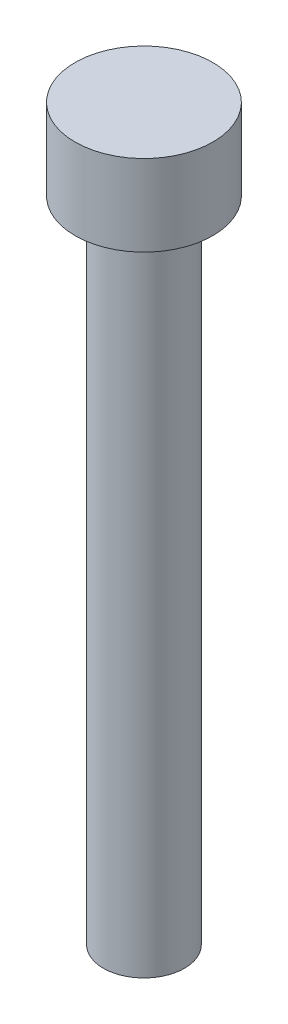
ISO-10303-21;
HEADER;
FILE_DESCRIPTION(('STEP AP214'),'2;1');
FILE_NAME('part.step','',(''),(''),'','','');
FILE_SCHEMA(('AUTOMOTIVE_DESIGN { 1 0 10303 214 1 1 1 1 }'));
ENDSEC;
DATA;
#1=APPLICATION_CONTEXT('core data for automotive mechanical design processes');
#2=APPLICATION_PROTOCOL_DEFINITION('international standard','automotive_design',2000,#1);
#3=PRODUCT_CONTEXT('',#1,'mechanical');
#4=PRODUCT('Part','Part','',(#3));
#5=PRODUCT_RELATED_PRODUCT_CATEGORY('part','',(#4));
#6=PRODUCT_DEFINITION_FORMATION('','',#4);
#7=PRODUCT_DEFINITION_CONTEXT('part definition',#1,'design');
#8=PRODUCT_DEFINITION('design','',#6,#7);
#9=PRODUCT_DEFINITION_SHAPE('','',#8);
#10=(LENGTH_UNIT() NAMED_UNIT(*) SI_UNIT(.MILLI.,.METRE.));
#11=(NAMED_UNIT(*) PLANE_ANGLE_UNIT() SI_UNIT($,.RADIAN.));
#12=(NAMED_UNIT(*) SI_UNIT($,.STERADIAN.) SOLID_ANGLE_UNIT());
#13=UNCERTAINTY_MEASURE_WITH_UNIT(LENGTH_MEASURE(1.E-05),#10,'distance_accuracy_value','');
#14=(GEOMETRIC_REPRESENTATION_CONTEXT(3) GLOBAL_UNCERTAINTY_ASSIGNED_CONTEXT((#13)) GLOBAL_UNIT_ASSIGNED_CONTEXT((#10,
#11,#12)) REPRESENTATION_CONTEXT('',''));
#15=CARTESIAN_POINT('',(0.,0.,0.));
#16=DIRECTION('',(0.,0.,1.));
#17=DIRECTION('',(1.,0.,0.));
#18=AXIS2_PLACEMENT_3D('',#15,#16,#17);
#19=CARTESIAN_POINT('',(0.,40.,0.));
#20=DIRECTION('',(0.,-1.,0.));
#21=DIRECTION('',(0.,0.,-1.));
#22=AXIS2_PLACEMENT_3D('',#19,#20,#21);
#23=CYLINDRICAL_SURFACE('',#22,2.5);
#24=CARTESIAN_POINT('',(0.,40.,0.));
#25=DIRECTION('',(0.,1.,0.));
#26=DIRECTION('',(0.,0.,1.));
#27=AXIS2_PLACEMENT_3D('',#24,#25,#26);
#28=CIRCLE('',#27,2.5);
#29=CARTESIAN_POINT('',(0.,40.,2.5));
#30=VERTEX_POINT('',#29);
#31=EDGE_CURVE('E10',#30,#30,#28,.T.);
#32=ORIENTED_EDGE('',*,*,#31,.F.);
#33=EDGE_LOOP('',(#32));
#34=FACE_BOUND('',#33,.T.);
#35=CARTESIAN_POINT('',(0.,0.,0.));
#36=DIRECTION('',(0.,1.,0.));
#37=DIRECTION('',(0.,0.,1.));
#38=AXIS2_PLACEMENT_3D('',#35,#36,#37);
#39=CIRCLE('',#38,2.5);
#40=CARTESIAN_POINT('',(0.,0.,2.5));
#41=VERTEX_POINT('',#40);
#42=EDGE_CURVE('E38',#41,#41,#39,.T.);
#43=ORIENTED_EDGE('',*,*,#42,.T.);
#44=EDGE_LOOP('',(#43));
#45=FACE_BOUND('',#44,.T.);
#46=ADVANCED_FACE('F35',(#34,#45),#23,.T.);
#47=CARTESIAN_POINT('',(0.,0.,0.));
#48=DIRECTION('',(0.,1.,0.));
#49=DIRECTION('',(0.,0.,1.));
#50=AXIS2_PLACEMENT_3D('',#47,#48,#49);
#51=PLANE('',#50);
#52=ORIENTED_EDGE('',*,*,#42,.F.);
#53=EDGE_LOOP('',(#52));
#54=FACE_BOUND('',#53,.T.);
#55=ADVANCED_FACE('F58',(#54),#51,.F.);
#56=CARTESIAN_POINT('',(0.,45.,0.));
#57=DIRECTION('',(0.,-1.,0.));
#58=DIRECTION('',(0.,0.,-1.));
#59=AXIS2_PLACEMENT_3D('',#56,#57,#58);
#60=CYLINDRICAL_SURFACE('',#59,4.25);
#61=CARTESIAN_POINT('',(0.,45.,0.));
#62=DIRECTION('',(0.,1.,0.));
#63=DIRECTION('',(0.,0.,1.));
#64=AXIS2_PLACEMENT_3D('',#61,#62,#63);
#65=CIRCLE('',#64,4.25);
#66=CARTESIAN_POINT('',(0.,45.,4.25));
#67=VERTEX_POINT('',#66);
#68=EDGE_CURVE('E45',#67,#67,#65,.T.);
#69=ORIENTED_EDGE('',*,*,#68,.F.);
#70=EDGE_LOOP('',(#69));
#71=FACE_BOUND('',#70,.T.);
#72=CARTESIAN_POINT('',(0.,40.,0.));
#73=DIRECTION('',(0.,1.,0.));
#74=DIRECTION('',(0.,0.,1.));
#75=AXIS2_PLACEMENT_3D('',#72,#73,#74);
#76=CIRCLE('',#75,4.25);
#77=CARTESIAN_POINT('',(0.,40.,4.25));
#78=VERTEX_POINT('',#77);
#79=EDGE_CURVE('E47',#78,#78,#76,.T.);
#80=ORIENTED_EDGE('',*,*,#79,.T.);
#81=EDGE_LOOP('',(#80));
#82=FACE_BOUND('',#81,.T.);
#83=ADVANCED_FACE('F55',(#71,#82),#60,.T.);
#84=CARTESIAN_POINT('',(0.,45.,0.));
#85=DIRECTION('',(0.,1.,0.));
#86=DIRECTION('',(0.,0.,1.));
#87=AXIS2_PLACEMENT_3D('',#84,#85,#86);
#88=PLANE('',#87);
#89=ORIENTED_EDGE('',*,*,#68,.T.);
#90=EDGE_LOOP('',(#89));
#91=FACE_BOUND('',#90,.T.);
#92=ADVANCED_FACE('F53',(#91),#88,.T.);
#93=CARTESIAN_POINT('',(0.,40.,0.));
#94=DIRECTION('',(0.,1.,0.));
#95=DIRECTION('',(0.,0.,1.));
#96=AXIS2_PLACEMENT_3D('',#93,#94,#95);
#97=PLANE('',#96);
#98=ORIENTED_EDGE('',*,*,#31,.T.);
#99=EDGE_LOOP('',(#98));
#100=FACE_BOUND('',#99,.T.);
#101=ORIENTED_EDGE('',*,*,#79,.F.);
#102=EDGE_LOOP('',(#101));
#103=FACE_BOUND('',#102,.T.);
#104=ADVANCED_FACE('F62',(#100,#103),#97,.F.);
#105=CLOSED_SHELL('',(#46,#55,#83,#92,#104));
#106=MANIFOLD_SOLID_BREP('B2',#105);
#107=ADVANCED_BREP_SHAPE_REPRESENTATION('',(#18,#106),#14);
#108=SHAPE_DEFINITION_REPRESENTATION(#9,#107);
ENDSEC;
END-ISO-10303-21;
